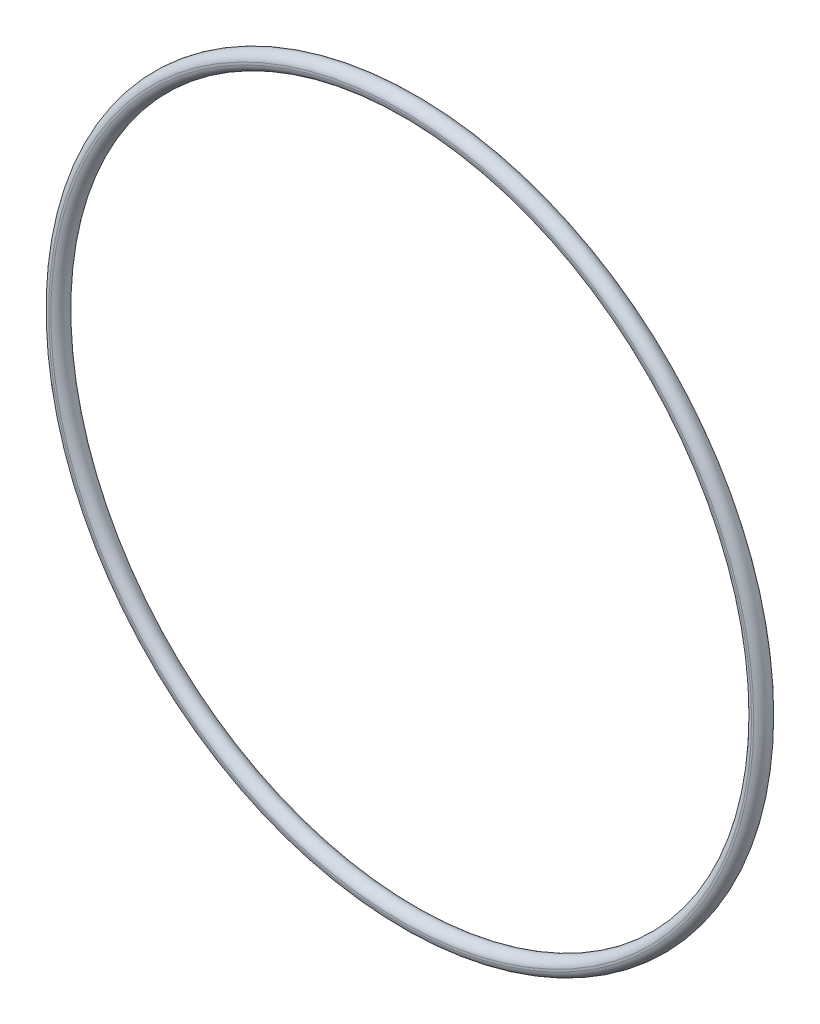
ISO-10303-21;
HEADER;
FILE_DESCRIPTION(('STEP AP214'),'2;1');
FILE_NAME('part.step','',(''),(''),'','','');
FILE_SCHEMA(('AUTOMOTIVE_DESIGN { 1 0 10303 214 1 1 1 1 }'));
ENDSEC;
DATA;
#1=APPLICATION_CONTEXT('core data for automotive mechanical design processes');
#2=APPLICATION_PROTOCOL_DEFINITION('international standard','automotive_design',2000,#1);
#3=PRODUCT_CONTEXT('',#1,'mechanical');
#4=PRODUCT('Part','Part','',(#3));
#5=PRODUCT_RELATED_PRODUCT_CATEGORY('part','',(#4));
#6=PRODUCT_DEFINITION_FORMATION('','',#4);
#7=PRODUCT_DEFINITION_CONTEXT('part definition',#1,'design');
#8=PRODUCT_DEFINITION('design','',#6,#7);
#9=PRODUCT_DEFINITION_SHAPE('','',#8);
#10=(LENGTH_UNIT() NAMED_UNIT(*) SI_UNIT(.MILLI.,.METRE.));
#11=(NAMED_UNIT(*) PLANE_ANGLE_UNIT() SI_UNIT($,.RADIAN.));
#12=(NAMED_UNIT(*) SI_UNIT($,.STERADIAN.) SOLID_ANGLE_UNIT());
#13=UNCERTAINTY_MEASURE_WITH_UNIT(LENGTH_MEASURE(1.E-05),#10,'distance_accuracy_value','');
#14=(GEOMETRIC_REPRESENTATION_CONTEXT(3) GLOBAL_UNCERTAINTY_ASSIGNED_CONTEXT((#13)) GLOBAL_UNIT_ASSIGNED_CONTEXT((#10,
#11,#12)) REPRESENTATION_CONTEXT('',''));
#15=CARTESIAN_POINT('',(0.,0.,0.));
#16=DIRECTION('',(0.,0.,1.));
#17=DIRECTION('',(1.,0.,0.));
#18=AXIS2_PLACEMENT_3D('',#15,#16,#17);
#19=CARTESIAN_POINT('',(0.,0.,0.));
#20=DIRECTION('',(0.,0.,1.));
#21=DIRECTION('',(1.,0.,0.));
#22=AXIS2_PLACEMENT_3D('',#19,#20,#21);
#23=TOROIDAL_SURFACE('',#22,107.1245,2.667);
#24=CARTESIAN_POINT('',(0.,0.,2.6455566278904));
#25=DIRECTION('',(0.,0.,1.));
#26=DIRECTION('',(1.,0.,0.));
#27=AXIS2_PLACEMENT_3D('',#24,#25,#26);
#28=CIRCLE('',#27,106.786980921095);
#29=CARTESIAN_POINT('',(106.786980921095,0.,2.6455566278904));
#30=VERTEX_POINT('',#29);
#31=EDGE_CURVE('E10',#30,#30,#28,.T.);
#32=ORIENTED_EDGE('',*,*,#31,.T.);
#33=EDGE_LOOP('',(#32));
#34=FACE_BOUND('',#33,.T.);
#35=CARTESIAN_POINT('',(0.,0.,-2.6455566278904));
#36=DIRECTION('',(0.,0.,1.));
#37=DIRECTION('',(1.,0.,0.));
#38=AXIS2_PLACEMENT_3D('',#35,#36,#37);
#39=CIRCLE('',#38,106.786980921095);
#40=CARTESIAN_POINT('',(106.786980921095,0.,-2.6455566278904));
#41=VERTEX_POINT('',#40);
#42=EDGE_CURVE('E56',#41,#41,#39,.T.);
#43=ORIENTED_EDGE('',*,*,#42,.F.);
#44=EDGE_LOOP('',(#43));
#45=FACE_BOUND('',#44,.T.);
#46=ADVANCED_FACE('F39',(#34,#45),#23,.T.);
#47=CARTESIAN_POINT('',(0.,0.,2.6455566278904));
#48=DIRECTION('',(0.,0.,1.));
#49=DIRECTION('',(1.,0.,0.));
#50=AXIS2_PLACEMENT_3D('',#47,#48,#49);
#51=PLANE('',#50);
#52=CARTESIAN_POINT('',(0.,0.,2.6455566278904));
#53=DIRECTION('',(0.,0.,1.));
#54=DIRECTION('',(1.,0.,0.));
#55=AXIS2_PLACEMENT_3D('',#52,#53,#54);
#56=CIRCLE('',#55,107.462019078905);
#57=CARTESIAN_POINT('',(107.462019078905,0.,2.6455566278904));
#58=VERTEX_POINT('',#57);
#59=EDGE_CURVE('E46',#58,#58,#56,.T.);
#60=ORIENTED_EDGE('',*,*,#59,.T.);
#61=EDGE_LOOP('',(#60));
#62=FACE_BOUND('',#61,.T.);
#63=ORIENTED_EDGE('',*,*,#31,.F.);
#64=EDGE_LOOP('',(#63));
#65=FACE_BOUND('',#64,.T.);
#66=ADVANCED_FACE('F66',(#62,#65),#51,.T.);
#67=CARTESIAN_POINT('',(0.,0.,0.));
#68=DIRECTION('',(0.,0.,1.));
#69=DIRECTION('',(1.,0.,0.));
#70=AXIS2_PLACEMENT_3D('',#67,#68,#69);
#71=TOROIDAL_SURFACE('',#70,107.1245,2.667);
#72=CARTESIAN_POINT('',(0.,0.,-2.6455566278904));
#73=DIRECTION('',(0.,0.,1.));
#74=DIRECTION('',(1.,0.,0.));
#75=AXIS2_PLACEMENT_3D('',#72,#73,#74);
#76=CIRCLE('',#75,107.462019078905);
#77=CARTESIAN_POINT('',(107.462019078905,0.,-2.6455566278904));
#78=VERTEX_POINT('',#77);
#79=EDGE_CURVE('E51',#78,#78,#76,.T.);
#80=ORIENTED_EDGE('',*,*,#79,.T.);
#81=EDGE_LOOP('',(#80));
#82=FACE_BOUND('',#81,.T.);
#83=ORIENTED_EDGE('',*,*,#59,.F.);
#84=EDGE_LOOP('',(#83));
#85=FACE_BOUND('',#84,.T.);
#86=ADVANCED_FACE('F70',(#82,#85),#71,.T.);
#87=CARTESIAN_POINT('',(0.,0.,-2.6455566278904));
#88=DIRECTION('',(0.,0.,1.));
#89=DIRECTION('',(1.,0.,0.));
#90=AXIS2_PLACEMENT_3D('',#87,#88,#89);
#91=PLANE('',#90);
#92=ORIENTED_EDGE('',*,*,#79,.F.);
#93=EDGE_LOOP('',(#92));
#94=FACE_BOUND('',#93,.T.);
#95=ORIENTED_EDGE('',*,*,#42,.T.);
#96=EDGE_LOOP('',(#95));
#97=FACE_BOUND('',#96,.T.);
#98=ADVANCED_FACE('F63',(#94,#97),#91,.F.);
#99=CLOSED_SHELL('',(#46,#66,#86,#98));
#100=MANIFOLD_SOLID_BREP('B2',#99);
#101=ADVANCED_BREP_SHAPE_REPRESENTATION('',(#18,#100),#14);
#102=SHAPE_DEFINITION_REPRESENTATION(#9,#101);
ENDSEC;
END-ISO-10303-21;
